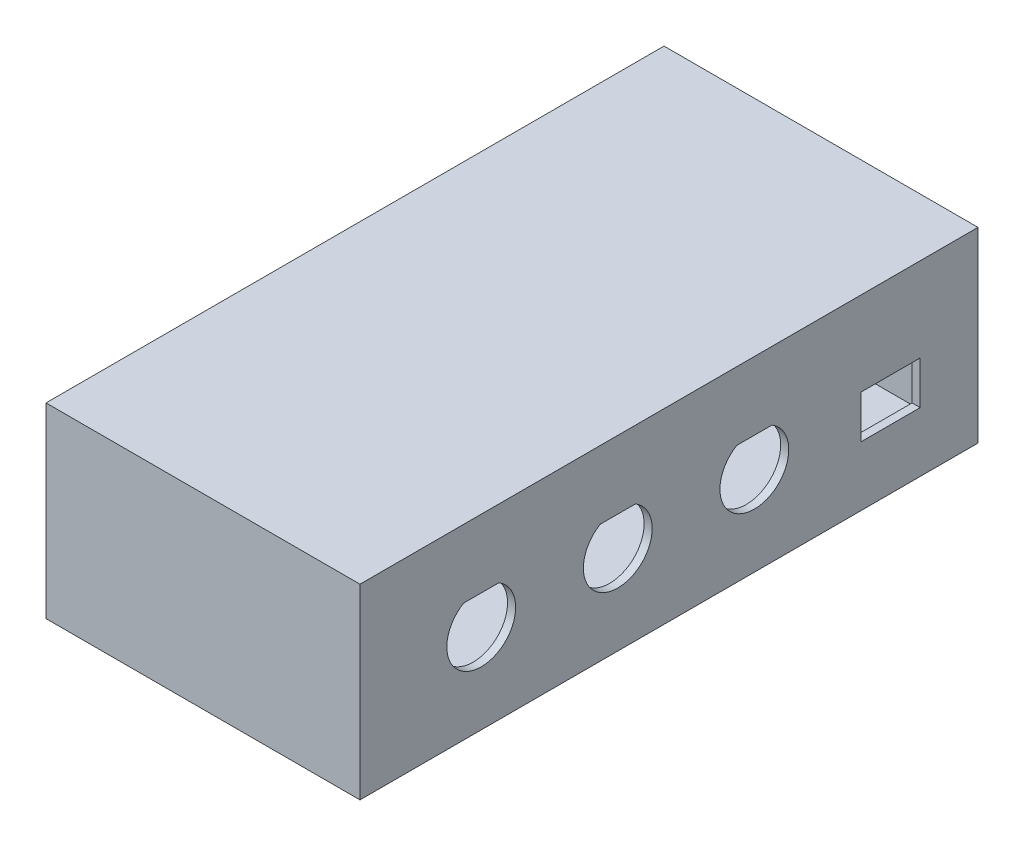
ISO-10303-21;
HEADER;
FILE_DESCRIPTION(('STEP AP214'),'2;1');
FILE_NAME('part.step','',(''),(''),'','','');
FILE_SCHEMA(('AUTOMOTIVE_DESIGN { 1 0 10303 214 1 1 1 1 }'));
ENDSEC;
DATA;
#1=APPLICATION_CONTEXT('core data for automotive mechanical design processes');
#2=APPLICATION_PROTOCOL_DEFINITION('international standard','automotive_design',2000,#1);
#3=PRODUCT_CONTEXT('',#1,'mechanical');
#4=PRODUCT('Part','Part','',(#3));
#5=PRODUCT_RELATED_PRODUCT_CATEGORY('part','',(#4));
#6=PRODUCT_DEFINITION_FORMATION('','',#4);
#7=PRODUCT_DEFINITION_CONTEXT('part definition',#1,'design');
#8=PRODUCT_DEFINITION('design','',#6,#7);
#9=PRODUCT_DEFINITION_SHAPE('','',#8);
#10=(LENGTH_UNIT() NAMED_UNIT(*) SI_UNIT(.MILLI.,.METRE.));
#11=(NAMED_UNIT(*) PLANE_ANGLE_UNIT() SI_UNIT($,.RADIAN.));
#12=(NAMED_UNIT(*) SI_UNIT($,.STERADIAN.) SOLID_ANGLE_UNIT());
#13=UNCERTAINTY_MEASURE_WITH_UNIT(LENGTH_MEASURE(1.E-05),#10,'distance_accuracy_value','');
#14=(GEOMETRIC_REPRESENTATION_CONTEXT(3) GLOBAL_UNCERTAINTY_ASSIGNED_CONTEXT((#13)) GLOBAL_UNIT_ASSIGNED_CONTEXT((#10,
#11,#12)) REPRESENTATION_CONTEXT('',''));
#15=CARTESIAN_POINT('',(0.,0.,0.));
#16=DIRECTION('',(0.,0.,1.));
#17=DIRECTION('',(1.,0.,0.));
#18=AXIS2_PLACEMENT_3D('',#15,#16,#17);
#19=CARTESIAN_POINT('',(-1058.5514361677,31.75,33.6356287123189));
#20=DIRECTION('',(1.,0.,0.));
#21=DIRECTION('',(0.,0.,-1.));
#22=AXIS2_PLACEMENT_3D('',#19,#20,#21);
#23=PLANE('',#22);
#24=DIRECTION('',(0.,0.,1.));
#25=VECTOR('',#24,1.);
#26=CARTESIAN_POINT('',(-1058.5514361677,-1.5,0.));
#27=LINE('',#26,#25);
#28=CARTESIAN_POINT('',(-1058.5514361677,-1.5,-79.8143712876811));
#29=VERTEX_POINT('',#28);
#30=CARTESIAN_POINT('',(-1058.5514361677,-1.5,35.1356287123189));
#31=VERTEX_POINT('',#30);
#32=EDGE_CURVE('E295',#29,#31,#27,.T.);
#33=ORIENTED_EDGE('',*,*,#32,.T.);
#34=DIRECTION('',(0.,-1.,0.));
#35=VECTOR('',#34,1.);
#36=CARTESIAN_POINT('',(-1058.5514361677,31.75,35.1356287123189));
#37=LINE('',#36,#35);
#38=CARTESIAN_POINT('',(-1058.5514361677,33.25,35.1356287123189));
#39=VERTEX_POINT('',#38);
#40=EDGE_CURVE('E292',#39,#31,#37,.T.);
#41=ORIENTED_EDGE('',*,*,#40,.F.);
#42=DIRECTION('',(0.,0.,1.));
#43=VECTOR('',#42,1.);
#44=CARTESIAN_POINT('',(-1058.5514361677,33.25,0.));
#45=LINE('',#44,#43);
#46=CARTESIAN_POINT('',(-1058.5514361677,33.25,-79.8143712876811));
#47=VERTEX_POINT('',#46);
#48=EDGE_CURVE('E41',#47,#39,#45,.T.);
#49=ORIENTED_EDGE('',*,*,#48,.F.);
#50=DIRECTION('',(0.,-1.,0.));
#51=VECTOR('',#50,1.);
#52=CARTESIAN_POINT('',(-1058.5514361677,31.75,-79.8143712876811));
#53=LINE('',#52,#51);
#54=EDGE_CURVE('E46',#47,#29,#53,.T.);
#55=ORIENTED_EDGE('',*,*,#54,.T.);
#56=EDGE_LOOP('',(#33,#41,#49,#55));
#57=FACE_BOUND('',#56,.T.);
#58=DIRECTION('',(0.,0.,1.));
#59=VECTOR('',#58,1.);
#60=CARTESIAN_POINT('',(-1058.5514361677,0.,33.6356287123189));
#61=LINE('',#60,#59);
#62=CARTESIAN_POINT('',(-1058.5514361677,0.,-78.3143712876811));
#63=VERTEX_POINT('',#62);
#64=CARTESIAN_POINT('',(-1058.5514361677,0.,33.6356287123189));
#65=VERTEX_POINT('',#64);
#66=EDGE_CURVE('E266',#63,#65,#61,.T.);
#67=ORIENTED_EDGE('',*,*,#66,.F.);
#68=DIRECTION('',(0.,-1.,0.));
#69=VECTOR('',#68,1.);
#70=CARTESIAN_POINT('',(-1058.5514361677,31.75,-78.3143712876811));
#71=LINE('',#70,#69);
#72=CARTESIAN_POINT('',(-1058.5514361677,31.75,-78.3143712876811));
#73=VERTEX_POINT('',#72);
#74=EDGE_CURVE('E274',#73,#63,#71,.T.);
#75=ORIENTED_EDGE('',*,*,#74,.F.);
#76=DIRECTION('',(0.,0.,1.));
#77=VECTOR('',#76,1.);
#78=CARTESIAN_POINT('',(-1058.5514361677,31.75,33.6356287123189));
#79=LINE('',#78,#77);
#80=CARTESIAN_POINT('',(-1058.5514361677,31.75,33.6356287123189));
#81=VERTEX_POINT('',#80);
#82=EDGE_CURVE('E256',#73,#81,#79,.T.);
#83=ORIENTED_EDGE('',*,*,#82,.T.);
#84=DIRECTION('',(0.,-1.,0.));
#85=VECTOR('',#84,1.);
#86=CARTESIAN_POINT('',(-1058.5514361677,31.75,33.6356287123189));
#87=LINE('',#86,#85);
#88=EDGE_CURVE('E271',#81,#65,#87,.T.);
#89=ORIENTED_EDGE('',*,*,#88,.T.);
#90=EDGE_LOOP('',(#67,#75,#83,#89));
#91=FACE_BOUND('',#90,.T.);
#92=ADVANCED_FACE('F37',(#57,#91),#23,.F.);
#93=CARTESIAN_POINT('',(-1000.1514361677,31.75,33.6356287123189));
#94=DIRECTION('',(-1.,0.,0.));
#95=DIRECTION('',(0.,0.,1.));
#96=AXIS2_PLACEMENT_3D('',#93,#94,#95);
#97=PLANE('',#96);
#98=DIRECTION('',(0.,0.,1.));
#99=VECTOR('',#98,1.);
#100=CARTESIAN_POINT('',(-1000.1514361677,20.5613200000001,15.8582423467096));
#101=LINE('',#100,#99);
#102=CARTESIAN_POINT('',(-1000.1514361677,20.5613200000001,9.31301507792816));
#103=VERTEX_POINT('',#102);
#104=CARTESIAN_POINT('',(-1000.1514361677,20.5613200000001,15.8582423467096));
#105=VERTEX_POINT('',#104);
#106=EDGE_CURVE('E178',#103,#105,#101,.T.);
#107=ORIENTED_EDGE('',*,*,#106,.F.);
#108=CARTESIAN_POINT('',(-1000.1514361677,15.0613200000001,12.5856287123189));
#109=DIRECTION('',(1.,0.,0.));
#110=DIRECTION('',(0.,0.,-1.));
#111=AXIS2_PLACEMENT_3D('',#108,#109,#110);
#112=CIRCLE('',#111,6.4);
#113=EDGE_CURVE('E54',#105,#103,#112,.T.);
#114=ORIENTED_EDGE('',*,*,#113,.F.);
#115=EDGE_LOOP('',(#107,#114));
#116=FACE_BOUND('',#115,.T.);
#117=DIRECTION('',(0.,0.,1.));
#118=VECTOR('',#117,1.);
#119=CARTESIAN_POINT('',(-1000.1514361677,20.5613200000001,-9.54175765329044));
#120=LINE('',#119,#118);
#121=CARTESIAN_POINT('',(-1000.1514361677,20.5613200000001,-16.0869849220719));
#122=VERTEX_POINT('',#121);
#123=CARTESIAN_POINT('',(-1000.1514361677,20.5613200000001,-9.54175765329044));
#124=VERTEX_POINT('',#123);
#125=EDGE_CURVE('E197',#122,#124,#120,.T.);
#126=ORIENTED_EDGE('',*,*,#125,.F.);
#127=CARTESIAN_POINT('',(-1000.1514361677,15.0613200000001,-12.8143712876811));
#128=DIRECTION('',(1.,0.,0.));
#129=DIRECTION('',(0.,0.,-1.));
#130=AXIS2_PLACEMENT_3D('',#127,#128,#129);
#131=CIRCLE('',#130,6.4);
#132=EDGE_CURVE('E62',#124,#122,#131,.T.);
#133=ORIENTED_EDGE('',*,*,#132,.F.);
#134=EDGE_LOOP('',(#126,#133));
#135=FACE_BOUND('',#134,.T.);
#136=DIRECTION('',(0.,0.,1.));
#137=VECTOR('',#136,1.);
#138=CARTESIAN_POINT('',(-1000.1514361677,20.5613200000001,-34.9417576532904));
#139=LINE('',#138,#137);
#140=CARTESIAN_POINT('',(-1000.1514361677,20.5613200000001,-41.4869849220719));
#141=VERTEX_POINT('',#140);
#142=CARTESIAN_POINT('',(-1000.1514361677,20.5613200000001,-34.9417576532904));
#143=VERTEX_POINT('',#142);
#144=EDGE_CURVE('E209',#141,#143,#139,.T.);
#145=ORIENTED_EDGE('',*,*,#144,.F.);
#146=CARTESIAN_POINT('',(-1000.1514361677,15.0613200000001,-38.2143712876811));
#147=DIRECTION('',(1.,0.,0.));
#148=DIRECTION('',(0.,0.,-1.));
#149=AXIS2_PLACEMENT_3D('',#146,#147,#148);
#150=CIRCLE('',#149,6.4);
#151=EDGE_CURVE('E213',#143,#141,#150,.T.);
#152=ORIENTED_EDGE('',*,*,#151,.F.);
#153=EDGE_LOOP('',(#145,#152));
#154=FACE_BOUND('',#153,.T.);
#155=DIRECTION('',(0.,0.,-1.));
#156=VECTOR('',#155,1.);
#157=CARTESIAN_POINT('',(-1000.1514361677,9.59407117880764,-58.0547439493861));
#158=LINE('',#157,#156);
#159=CARTESIAN_POINT('',(-1000.1514361677,9.59407117880764,-58.0547439493861));
#160=VERTEX_POINT('',#159);
#161=CARTESIAN_POINT('',(-1000.1514361677,9.59407117880764,-69.0547439493861));
#162=VERTEX_POINT('',#161);
#163=EDGE_CURVE('E227',#160,#162,#158,.T.);
#164=ORIENTED_EDGE('',*,*,#163,.F.);
#165=DIRECTION('',(0.,-1.,0.));
#166=VECTOR('',#165,1.);
#167=CARTESIAN_POINT('',(-1000.1514361677,17.5940711788076,-58.0547439493861));
#168=LINE('',#167,#166);
#169=CARTESIAN_POINT('',(-1000.1514361677,17.5940711788076,-58.0547439493861));
#170=VERTEX_POINT('',#169);
#171=EDGE_CURVE('E225',#170,#160,#168,.T.);
#172=ORIENTED_EDGE('',*,*,#171,.F.);
#173=DIRECTION('',(0.,0.,1.));
#174=VECTOR('',#173,1.);
#175=CARTESIAN_POINT('',(-1000.1514361677,17.5940711788076,-58.0547439493861));
#176=LINE('',#175,#174);
#177=CARTESIAN_POINT('',(-1000.1514361677,17.5940711788076,-69.0547439493861));
#178=VERTEX_POINT('',#177);
#179=EDGE_CURVE('E233',#178,#170,#176,.T.);
#180=ORIENTED_EDGE('',*,*,#179,.F.);
#181=DIRECTION('',(0.,1.,0.));
#182=VECTOR('',#181,1.);
#183=CARTESIAN_POINT('',(-1000.1514361677,17.5940711788076,-69.0547439493861));
#184=LINE('',#183,#182);
#185=EDGE_CURVE('E230',#162,#178,#184,.T.);
#186=ORIENTED_EDGE('',*,*,#185,.F.);
#187=EDGE_LOOP('',(#164,#172,#180,#186));
#188=FACE_BOUND('',#187,.T.);
#189=DIRECTION('',(0.,0.,-1.));
#190=VECTOR('',#189,1.);
#191=CARTESIAN_POINT('',(-1000.1514361677,-1.5,0.));
#192=LINE('',#191,#190);
#193=CARTESIAN_POINT('',(-1000.1514361677,-1.5,35.1356287123189));
#194=VERTEX_POINT('',#193);
#195=CARTESIAN_POINT('',(-1000.1514361677,-1.5,-79.8143712876811));
#196=VERTEX_POINT('',#195);
#197=EDGE_CURVE('E280',#194,#196,#192,.T.);
#198=ORIENTED_EDGE('',*,*,#197,.T.);
#199=DIRECTION('',(0.,-1.,0.));
#200=VECTOR('',#199,1.);
#201=CARTESIAN_POINT('',(-1000.1514361677,31.75,-79.8143712876811));
#202=LINE('',#201,#200);
#203=CARTESIAN_POINT('',(-1000.1514361677,33.25,-79.8143712876811));
#204=VERTEX_POINT('',#203);
#205=EDGE_CURVE('E11',#204,#196,#202,.T.);
#206=ORIENTED_EDGE('',*,*,#205,.F.);
#207=DIRECTION('',(0.,0.,-1.));
#208=VECTOR('',#207,1.);
#209=CARTESIAN_POINT('',(-1000.1514361677,33.25,0.));
#210=LINE('',#209,#208);
#211=CARTESIAN_POINT('',(-1000.1514361677,33.25,35.1356287123189));
#212=VERTEX_POINT('',#211);
#213=EDGE_CURVE('E284',#212,#204,#210,.T.);
#214=ORIENTED_EDGE('',*,*,#213,.F.);
#215=DIRECTION('',(0.,-1.,0.));
#216=VECTOR('',#215,1.);
#217=CARTESIAN_POINT('',(-1000.1514361677,31.75,35.1356287123189));
#218=LINE('',#217,#216);
#219=EDGE_CURVE('E289',#212,#194,#218,.T.);
#220=ORIENTED_EDGE('',*,*,#219,.T.);
#221=EDGE_LOOP('',(#198,#206,#214,#220));
#222=FACE_BOUND('',#221,.T.);
#223=ADVANCED_FACE('F315',(#116,#135,#154,#188,#222),#97,.F.);
#224=CARTESIAN_POINT('',(-1058.5514361677,31.75,-79.8143712876811));
#225=DIRECTION('',(0.,0.,1.));
#226=DIRECTION('',(1.,0.,0.));
#227=AXIS2_PLACEMENT_3D('',#224,#225,#226);
#228=PLANE('',#227);
#229=DIRECTION('',(-1.,0.,0.));
#230=VECTOR('',#229,1.);
#231=CARTESIAN_POINT('',(0.,-1.5,-79.8143712876811));
#232=LINE('',#231,#230);
#233=EDGE_CURVE('E282',#196,#29,#232,.T.);
#234=ORIENTED_EDGE('',*,*,#233,.T.);
#235=ORIENTED_EDGE('',*,*,#54,.F.);
#236=DIRECTION('',(-1.,0.,0.));
#237=VECTOR('',#236,1.);
#238=CARTESIAN_POINT('',(0.,33.25,-79.8143712876811));
#239=LINE('',#238,#237);
#240=EDGE_CURVE('E287',#204,#47,#239,.T.);
#241=ORIENTED_EDGE('',*,*,#240,.F.);
#242=ORIENTED_EDGE('',*,*,#205,.T.);
#243=EDGE_LOOP('',(#234,#235,#241,#242));
#244=FACE_BOUND('',#243,.T.);
#245=ADVANCED_FACE('F322',(#244),#228,.F.);
#246=CARTESIAN_POINT('',(-1058.5514361677,31.75,35.1356287123189));
#247=DIRECTION('',(0.,0.,-1.));
#248=DIRECTION('',(-1.,0.,0.));
#249=AXIS2_PLACEMENT_3D('',#246,#247,#248);
#250=PLANE('',#249);
#251=DIRECTION('',(1.,0.,0.));
#252=VECTOR('',#251,1.);
#253=CARTESIAN_POINT('',(0.,-1.5,35.1356287123189));
#254=LINE('',#253,#252);
#255=EDGE_CURVE('E288',#31,#194,#254,.T.);
#256=ORIENTED_EDGE('',*,*,#255,.T.);
#257=ORIENTED_EDGE('',*,*,#219,.F.);
#258=DIRECTION('',(1.,0.,0.));
#259=VECTOR('',#258,1.);
#260=CARTESIAN_POINT('',(0.,33.25,35.1356287123189));
#261=LINE('',#260,#259);
#262=EDGE_CURVE('E293',#39,#212,#261,.T.);
#263=ORIENTED_EDGE('',*,*,#262,.F.);
#264=ORIENTED_EDGE('',*,*,#40,.T.);
#265=EDGE_LOOP('',(#256,#257,#263,#264));
#266=FACE_BOUND('',#265,.T.);
#267=ADVANCED_FACE('F306',(#266),#250,.F.);
#268=CARTESIAN_POINT('',(0.,33.25,0.));
#269=DIRECTION('',(0.,-1.,0.));
#270=DIRECTION('',(0.,0.,-1.));
#271=AXIS2_PLACEMENT_3D('',#268,#269,#270);
#272=PLANE('',#271);
#273=ORIENTED_EDGE('',*,*,#213,.T.);
#274=ORIENTED_EDGE('',*,*,#240,.T.);
#275=ORIENTED_EDGE('',*,*,#48,.T.);
#276=ORIENTED_EDGE('',*,*,#262,.T.);
#277=EDGE_LOOP('',(#273,#274,#275,#276));
#278=FACE_BOUND('',#277,.T.);
#279=ADVANCED_FACE('F318',(#278),#272,.F.);
#280=CARTESIAN_POINT('',(0.,-1.5,0.));
#281=DIRECTION('',(0.,-1.,0.));
#282=DIRECTION('',(0.,0.,-1.));
#283=AXIS2_PLACEMENT_3D('',#280,#281,#282);
#284=PLANE('',#283);
#285=ORIENTED_EDGE('',*,*,#197,.F.);
#286=ORIENTED_EDGE('',*,*,#255,.F.);
#287=ORIENTED_EDGE('',*,*,#32,.F.);
#288=ORIENTED_EDGE('',*,*,#233,.F.);
#289=EDGE_LOOP('',(#285,#286,#287,#288));
#290=FACE_BOUND('',#289,.T.);
#291=ADVANCED_FACE('F39',(#290),#284,.T.);
#292=CARTESIAN_POINT('',(-1001.6514361677,31.75,33.6356287123189));
#293=DIRECTION('',(-1.,0.,0.));
#294=DIRECTION('',(0.,0.,1.));
#295=AXIS2_PLACEMENT_3D('',#292,#293,#294);
#296=PLANE('',#295);
#297=CARTESIAN_POINT('',(-1001.6514361677,15.0613200000001,12.5856287123189));
#298=DIRECTION('',(-1.,0.,0.));
#299=DIRECTION('',(0.,0.,1.));
#300=AXIS2_PLACEMENT_3D('',#297,#298,#299);
#301=CIRCLE('',#300,6.4);
#302=CARTESIAN_POINT('',(-1001.6514361677,20.5613200000001,15.8582423467096));
#303=VERTEX_POINT('',#302);
#304=CARTESIAN_POINT('',(-1001.6514361677,20.5613200000001,9.31301507792815));
#305=VERTEX_POINT('',#304);
#306=EDGE_CURVE('E177',#303,#305,#301,.F.);
#307=ORIENTED_EDGE('',*,*,#306,.T.);
#308=DIRECTION('',(0.,0.,1.));
#309=VECTOR('',#308,1.);
#310=CARTESIAN_POINT('',(-1001.6514361677,20.5613200000001,15.8582423467096));
#311=LINE('',#310,#309);
#312=EDGE_CURVE('E165',#305,#303,#311,.T.);
#313=ORIENTED_EDGE('',*,*,#312,.T.);
#314=EDGE_LOOP('',(#307,#313));
#315=FACE_BOUND('',#314,.T.);
#316=CARTESIAN_POINT('',(-1001.6514361677,15.0613200000001,-12.8143712876811));
#317=DIRECTION('',(-1.,0.,0.));
#318=DIRECTION('',(0.,0.,1.));
#319=AXIS2_PLACEMENT_3D('',#316,#317,#318);
#320=CIRCLE('',#319,6.4);
#321=CARTESIAN_POINT('',(-1001.6514361677,20.5613200000001,-9.54175765329044));
#322=VERTEX_POINT('',#321);
#323=CARTESIAN_POINT('',(-1001.6514361677,20.5613200000001,-16.0869849220719));
#324=VERTEX_POINT('',#323);
#325=EDGE_CURVE('E182',#322,#324,#320,.F.);
#326=ORIENTED_EDGE('',*,*,#325,.T.);
#327=DIRECTION('',(0.,0.,1.));
#328=VECTOR('',#327,1.);
#329=CARTESIAN_POINT('',(-1001.6514361677,20.5613200000001,-9.54175765329044));
#330=LINE('',#329,#328);
#331=EDGE_CURVE('E190',#324,#322,#330,.T.);
#332=ORIENTED_EDGE('',*,*,#331,.T.);
#333=EDGE_LOOP('',(#326,#332));
#334=FACE_BOUND('',#333,.T.);
#335=CARTESIAN_POINT('',(-1001.6514361677,15.0613200000001,-38.2143712876811));
#336=DIRECTION('',(-1.,0.,0.));
#337=DIRECTION('',(0.,0.,1.));
#338=AXIS2_PLACEMENT_3D('',#335,#336,#337);
#339=CIRCLE('',#338,6.4);
#340=CARTESIAN_POINT('',(-1001.6514361677,20.5613200000001,-34.9417576532904));
#341=VERTEX_POINT('',#340);
#342=CARTESIAN_POINT('',(-1001.6514361677,20.5613200000001,-41.4869849220719));
#343=VERTEX_POINT('',#342);
#344=EDGE_CURVE('E194',#341,#343,#339,.F.);
#345=ORIENTED_EDGE('',*,*,#344,.T.);
#346=DIRECTION('',(0.,0.,1.));
#347=VECTOR('',#346,1.);
#348=CARTESIAN_POINT('',(-1001.6514361677,20.5613200000001,-34.9417576532904));
#349=LINE('',#348,#347);
#350=EDGE_CURVE('E202',#343,#341,#349,.T.);
#351=ORIENTED_EDGE('',*,*,#350,.T.);
#352=EDGE_LOOP('',(#345,#351));
#353=FACE_BOUND('',#352,.T.);
#354=DIRECTION('',(0.,-1.,0.));
#355=VECTOR('',#354,1.);
#356=CARTESIAN_POINT('',(-1001.6514361677,17.5940711788076,-58.0547439493861));
#357=LINE('',#356,#355);
#358=CARTESIAN_POINT('',(-1001.6514361677,17.5940711788076,-58.0547439493861));
#359=VERTEX_POINT('',#358);
#360=CARTESIAN_POINT('',(-1001.6514361677,9.59407117880764,-58.0547439493861));
#361=VERTEX_POINT('',#360);
#362=EDGE_CURVE('E222',#359,#361,#357,.T.);
#363=ORIENTED_EDGE('',*,*,#362,.T.);
#364=DIRECTION('',(0.,0.,-1.));
#365=VECTOR('',#364,1.);
#366=CARTESIAN_POINT('',(-1001.6514361677,9.59407117880764,-58.0547439493861));
#367=LINE('',#366,#365);
#368=CARTESIAN_POINT('',(-1001.6514361677,9.59407117880764,-69.0547439493861));
#369=VERTEX_POINT('',#368);
#370=EDGE_CURVE('E239',#361,#369,#367,.T.);
#371=ORIENTED_EDGE('',*,*,#370,.T.);
#372=DIRECTION('',(0.,1.,0.));
#373=VECTOR('',#372,1.);
#374=CARTESIAN_POINT('',(-1001.6514361677,17.5940711788076,-69.0547439493861));
#375=LINE('',#374,#373);
#376=CARTESIAN_POINT('',(-1001.6514361677,17.5940711788076,-69.0547439493861));
#377=VERTEX_POINT('',#376);
#378=EDGE_CURVE('E174',#369,#377,#375,.T.);
#379=ORIENTED_EDGE('',*,*,#378,.T.);
#380=DIRECTION('',(0.,0.,1.));
#381=VECTOR('',#380,1.);
#382=CARTESIAN_POINT('',(-1001.6514361677,17.5940711788076,-58.0547439493861));
#383=LINE('',#382,#381);
#384=EDGE_CURVE('E219',#377,#359,#383,.T.);
#385=ORIENTED_EDGE('',*,*,#384,.T.);
#386=EDGE_LOOP('',(#363,#371,#379,#385));
#387=FACE_BOUND('',#386,.T.);
#388=DIRECTION('',(0.,0.,-1.));
#389=VECTOR('',#388,1.);
#390=CARTESIAN_POINT('',(-1001.6514361677,0.,33.6356287123189));
#391=LINE('',#390,#389);
#392=CARTESIAN_POINT('',(-1001.6514361677,0.,33.6356287123189));
#393=VERTEX_POINT('',#392);
#394=CARTESIAN_POINT('',(-1001.6514361677,0.,-78.3143712876811));
#395=VERTEX_POINT('',#394);
#396=EDGE_CURVE('E248',#393,#395,#391,.T.);
#397=ORIENTED_EDGE('',*,*,#396,.F.);
#398=DIRECTION('',(0.,-1.,0.));
#399=VECTOR('',#398,1.);
#400=CARTESIAN_POINT('',(-1001.6514361677,31.75,33.6356287123189));
#401=LINE('',#400,#399);
#402=CARTESIAN_POINT('',(-1001.6514361677,31.75,33.6356287123189));
#403=VERTEX_POINT('',#402);
#404=EDGE_CURVE('E261',#403,#393,#401,.T.);
#405=ORIENTED_EDGE('',*,*,#404,.F.);
#406=DIRECTION('',(0.,0.,-1.));
#407=VECTOR('',#406,1.);
#408=CARTESIAN_POINT('',(-1001.6514361677,31.75,33.6356287123189));
#409=LINE('',#408,#407);
#410=CARTESIAN_POINT('',(-1001.6514361677,31.75,-78.3143712876811));
#411=VERTEX_POINT('',#410);
#412=EDGE_CURVE('E249',#403,#411,#409,.T.);
#413=ORIENTED_EDGE('',*,*,#412,.T.);
#414=DIRECTION('',(0.,-1.,0.));
#415=VECTOR('',#414,1.);
#416=CARTESIAN_POINT('',(-1001.6514361677,31.75,-78.3143712876811));
#417=LINE('',#416,#415);
#418=EDGE_CURVE('E277',#411,#395,#417,.T.);
#419=ORIENTED_EDGE('',*,*,#418,.T.);
#420=EDGE_LOOP('',(#397,#405,#413,#419));
#421=FACE_BOUND('',#420,.T.);
#422=ADVANCED_FACE('F180',(#315,#334,#353,#387,#421),#296,.T.);
#423=CARTESIAN_POINT('',(-1058.5514361677,31.75,-78.3143712876811));
#424=DIRECTION('',(0.,0.,1.));
#425=DIRECTION('',(1.,0.,0.));
#426=AXIS2_PLACEMENT_3D('',#423,#424,#425);
#427=PLANE('',#426);
#428=DIRECTION('',(-1.,0.,0.));
#429=VECTOR('',#428,1.);
#430=CARTESIAN_POINT('',(-1058.5514361677,0.,-78.3143712876811));
#431=LINE('',#430,#429);
#432=EDGE_CURVE('E264',#395,#63,#431,.T.);
#433=ORIENTED_EDGE('',*,*,#432,.F.);
#434=ORIENTED_EDGE('',*,*,#418,.F.);
#435=DIRECTION('',(-1.,0.,0.));
#436=VECTOR('',#435,1.);
#437=CARTESIAN_POINT('',(-1058.5514361677,31.75,-78.3143712876811));
#438=LINE('',#437,#436);
#439=EDGE_CURVE('E252',#411,#73,#438,.T.);
#440=ORIENTED_EDGE('',*,*,#439,.T.);
#441=ORIENTED_EDGE('',*,*,#74,.T.);
#442=EDGE_LOOP('',(#433,#434,#440,#441));
#443=FACE_BOUND('',#442,.T.);
#444=ADVANCED_FACE('F339',(#443),#427,.T.);
#445=CARTESIAN_POINT('',(-1058.5514361677,31.75,33.6356287123189));
#446=DIRECTION('',(0.,0.,-1.));
#447=DIRECTION('',(-1.,0.,0.));
#448=AXIS2_PLACEMENT_3D('',#445,#446,#447);
#449=PLANE('',#448);
#450=DIRECTION('',(1.,0.,0.));
#451=VECTOR('',#450,1.);
#452=CARTESIAN_POINT('',(-1058.5514361677,0.,33.6356287123189));
#453=LINE('',#452,#451);
#454=EDGE_CURVE('E253',#65,#393,#453,.T.);
#455=ORIENTED_EDGE('',*,*,#454,.F.);
#456=ORIENTED_EDGE('',*,*,#88,.F.);
#457=DIRECTION('',(1.,0.,0.));
#458=VECTOR('',#457,1.);
#459=CARTESIAN_POINT('',(-1058.5514361677,31.75,33.6356287123189));
#460=LINE('',#459,#458);
#461=EDGE_CURVE('E259',#81,#403,#460,.T.);
#462=ORIENTED_EDGE('',*,*,#461,.T.);
#463=ORIENTED_EDGE('',*,*,#404,.T.);
#464=EDGE_LOOP('',(#455,#456,#462,#463));
#465=FACE_BOUND('',#464,.T.);
#466=ADVANCED_FACE('F342',(#465),#449,.T.);
#467=CARTESIAN_POINT('',(0.,31.75,0.));
#468=DIRECTION('',(0.,-1.,0.));
#469=DIRECTION('',(0.,0.,-1.));
#470=AXIS2_PLACEMENT_3D('',#467,#468,#469);
#471=PLANE('',#470);
#472=ORIENTED_EDGE('',*,*,#412,.F.);
#473=ORIENTED_EDGE('',*,*,#461,.F.);
#474=ORIENTED_EDGE('',*,*,#82,.F.);
#475=ORIENTED_EDGE('',*,*,#439,.F.);
#476=EDGE_LOOP('',(#472,#473,#474,#475));
#477=FACE_BOUND('',#476,.T.);
#478=ADVANCED_FACE('F346',(#477),#471,.T.);
#479=CARTESIAN_POINT('',(0.,0.,0.));
#480=DIRECTION('',(0.,-1.,0.));
#481=DIRECTION('',(0.,0.,-1.));
#482=AXIS2_PLACEMENT_3D('',#479,#480,#481);
#483=PLANE('',#482);
#484=ORIENTED_EDGE('',*,*,#396,.T.);
#485=ORIENTED_EDGE('',*,*,#432,.T.);
#486=ORIENTED_EDGE('',*,*,#66,.T.);
#487=ORIENTED_EDGE('',*,*,#454,.T.);
#488=EDGE_LOOP('',(#484,#485,#486,#487));
#489=FACE_BOUND('',#488,.T.);
#490=ADVANCED_FACE('F348',(#489),#483,.F.);
#491=CARTESIAN_POINT('',(-1058.5524361677,17.5940711788076,-58.0547439493861));
#492=DIRECTION('',(0.,0.,1.));
#493=DIRECTION('',(1.,0.,0.));
#494=AXIS2_PLACEMENT_3D('',#491,#492,#493);
#495=PLANE('',#494);
#496=DIRECTION('',(1.,0.,0.));
#497=VECTOR('',#496,1.);
#498=CARTESIAN_POINT('',(-1058.5524361677,17.5940711788076,-58.0547439493861));
#499=LINE('',#498,#497);
#500=EDGE_CURVE('E237',#359,#170,#499,.T.);
#501=ORIENTED_EDGE('',*,*,#500,.T.);
#502=ORIENTED_EDGE('',*,*,#171,.T.);
#503=DIRECTION('',(1.,0.,0.));
#504=VECTOR('',#503,1.);
#505=CARTESIAN_POINT('',(-1058.5524361677,9.59407117880764,-58.0547439493861));
#506=LINE('',#505,#504);
#507=EDGE_CURVE('E236',#361,#160,#506,.T.);
#508=ORIENTED_EDGE('',*,*,#507,.F.);
#509=ORIENTED_EDGE('',*,*,#362,.F.);
#510=EDGE_LOOP('',(#501,#502,#508,#509));
#511=FACE_BOUND('',#510,.T.);
#512=ADVANCED_FACE('F351',(#511),#495,.F.);
#513=CARTESIAN_POINT('',(-1058.5524361677,17.5940711788076,-58.0547439493861));
#514=DIRECTION('',(0.,1.,0.));
#515=DIRECTION('',(0.,0.,1.));
#516=AXIS2_PLACEMENT_3D('',#513,#514,#515);
#517=PLANE('',#516);
#518=DIRECTION('',(1.,0.,0.));
#519=VECTOR('',#518,1.);
#520=CARTESIAN_POINT('',(-1058.5524361677,17.5940711788076,-69.0547439493861));
#521=LINE('',#520,#519);
#522=EDGE_CURVE('E240',#377,#178,#521,.T.);
#523=ORIENTED_EDGE('',*,*,#522,.T.);
#524=ORIENTED_EDGE('',*,*,#179,.T.);
#525=ORIENTED_EDGE('',*,*,#500,.F.);
#526=ORIENTED_EDGE('',*,*,#384,.F.);
#527=EDGE_LOOP('',(#523,#524,#525,#526));
#528=FACE_BOUND('',#527,.T.);
#529=ADVANCED_FACE('F358',(#528),#517,.F.);
#530=CARTESIAN_POINT('',(-1058.5524361677,17.5940711788076,-69.0547439493861));
#531=DIRECTION('',(0.,0.,-1.));
#532=DIRECTION('',(-1.,0.,0.));
#533=AXIS2_PLACEMENT_3D('',#530,#531,#532);
#534=PLANE('',#533);
#535=DIRECTION('',(1.,0.,0.));
#536=VECTOR('',#535,1.);
#537=CARTESIAN_POINT('',(-1058.5524361677,9.59407117880764,-69.0547439493861));
#538=LINE('',#537,#536);
#539=EDGE_CURVE('E242',#369,#162,#538,.T.);
#540=ORIENTED_EDGE('',*,*,#539,.T.);
#541=ORIENTED_EDGE('',*,*,#185,.T.);
#542=ORIENTED_EDGE('',*,*,#522,.F.);
#543=ORIENTED_EDGE('',*,*,#378,.F.);
#544=EDGE_LOOP('',(#540,#541,#542,#543));
#545=FACE_BOUND('',#544,.T.);
#546=ADVANCED_FACE('F364',(#545),#534,.F.);
#547=CARTESIAN_POINT('',(-1058.5524361677,9.59407117880764,-58.0547439493861));
#548=DIRECTION('',(0.,-1.,0.));
#549=DIRECTION('',(0.,0.,-1.));
#550=AXIS2_PLACEMENT_3D('',#547,#548,#549);
#551=PLANE('',#550);
#552=ORIENTED_EDGE('',*,*,#507,.T.);
#553=ORIENTED_EDGE('',*,*,#163,.T.);
#554=ORIENTED_EDGE('',*,*,#539,.F.);
#555=ORIENTED_EDGE('',*,*,#370,.F.);
#556=EDGE_LOOP('',(#552,#553,#554,#555));
#557=FACE_BOUND('',#556,.T.);
#558=ADVANCED_FACE('F360',(#557),#551,.F.);
#559=CARTESIAN_POINT('',(-1058.5524361677,15.0613200000001,-38.2143712876811));
#560=DIRECTION('',(1.,0.,0.));
#561=DIRECTION('',(0.,0.,-1.));
#562=AXIS2_PLACEMENT_3D('',#559,#560,#561);
#563=CYLINDRICAL_SURFACE('',#562,6.4);
#564=DIRECTION('',(1.,0.,0.));
#565=VECTOR('',#564,1.);
#566=CARTESIAN_POINT('',(-1058.5524361677,20.5613200000001,-34.9417576532904));
#567=LINE('',#566,#565);
#568=EDGE_CURVE('E205',#341,#143,#567,.T.);
#569=ORIENTED_EDGE('',*,*,#568,.T.);
#570=ORIENTED_EDGE('',*,*,#151,.T.);
#571=DIRECTION('',(1.,0.,0.));
#572=VECTOR('',#571,1.);
#573=CARTESIAN_POINT('',(-1058.5524361677,20.5613200000001,-41.4869849220719));
#574=LINE('',#573,#572);
#575=EDGE_CURVE('E206',#343,#141,#574,.T.);
#576=ORIENTED_EDGE('',*,*,#575,.F.);
#577=ORIENTED_EDGE('',*,*,#344,.F.);
#578=EDGE_LOOP('',(#569,#570,#576,#577));
#579=FACE_BOUND('',#578,.T.);
#580=ADVANCED_FACE('F363',(#579),#563,.F.);
#581=CARTESIAN_POINT('',(-1058.5524361677,20.5613200000001,-34.9417576532904));
#582=DIRECTION('',(0.,1.,0.));
#583=DIRECTION('',(0.,0.,1.));
#584=AXIS2_PLACEMENT_3D('',#581,#582,#583);
#585=PLANE('',#584);
#586=ORIENTED_EDGE('',*,*,#575,.T.);
#587=ORIENTED_EDGE('',*,*,#144,.T.);
#588=ORIENTED_EDGE('',*,*,#568,.F.);
#589=ORIENTED_EDGE('',*,*,#350,.F.);
#590=EDGE_LOOP('',(#586,#587,#588,#589));
#591=FACE_BOUND('',#590,.T.);
#592=ADVANCED_FACE('F372',(#591),#585,.F.);
#593=CARTESIAN_POINT('',(-1058.5524361677,15.0613200000001,-12.8143712876811));
#594=DIRECTION('',(1.,0.,0.));
#595=DIRECTION('',(0.,0.,-1.));
#596=AXIS2_PLACEMENT_3D('',#593,#594,#595);
#597=CYLINDRICAL_SURFACE('',#596,6.4);
#598=DIRECTION('',(1.,0.,0.));
#599=VECTOR('',#598,1.);
#600=CARTESIAN_POINT('',(-1058.5524361677,20.5613200000001,-9.54175765329044));
#601=LINE('',#600,#599);
#602=EDGE_CURVE('E193',#322,#124,#601,.T.);
#603=ORIENTED_EDGE('',*,*,#602,.T.);
#604=ORIENTED_EDGE('',*,*,#132,.T.);
#605=DIRECTION('',(1.,0.,0.));
#606=VECTOR('',#605,1.);
#607=CARTESIAN_POINT('',(-1058.5524361677,20.5613200000001,-16.0869849220719));
#608=LINE('',#607,#606);
#609=EDGE_CURVE('E195',#324,#122,#608,.T.);
#610=ORIENTED_EDGE('',*,*,#609,.F.);
#611=ORIENTED_EDGE('',*,*,#325,.F.);
#612=EDGE_LOOP('',(#603,#604,#610,#611));
#613=FACE_BOUND('',#612,.T.);
#614=ADVANCED_FACE('F375',(#613),#597,.F.);
#615=CARTESIAN_POINT('',(-1058.5524361677,20.5613200000001,-9.54175765329044));
#616=DIRECTION('',(0.,1.,0.));
#617=DIRECTION('',(0.,0.,1.));
#618=AXIS2_PLACEMENT_3D('',#615,#616,#617);
#619=PLANE('',#618);
#620=ORIENTED_EDGE('',*,*,#609,.T.);
#621=ORIENTED_EDGE('',*,*,#125,.T.);
#622=ORIENTED_EDGE('',*,*,#602,.F.);
#623=ORIENTED_EDGE('',*,*,#331,.F.);
#624=EDGE_LOOP('',(#620,#621,#622,#623));
#625=FACE_BOUND('',#624,.T.);
#626=ADVANCED_FACE('F380',(#625),#619,.F.);
#627=CARTESIAN_POINT('',(-1058.5524361677,15.0613200000001,12.5856287123189));
#628=DIRECTION('',(1.,0.,0.));
#629=DIRECTION('',(0.,0.,-1.));
#630=AXIS2_PLACEMENT_3D('',#627,#628,#629);
#631=CYLINDRICAL_SURFACE('',#630,6.4);
#632=DIRECTION('',(1.,0.,0.));
#633=VECTOR('',#632,1.);
#634=CARTESIAN_POINT('',(-1058.5524361677,20.5613200000001,15.8582423467096));
#635=LINE('',#634,#633);
#636=EDGE_CURVE('E170',#303,#105,#635,.T.);
#637=ORIENTED_EDGE('',*,*,#636,.T.);
#638=ORIENTED_EDGE('',*,*,#113,.T.);
#639=DIRECTION('',(1.,0.,0.));
#640=VECTOR('',#639,1.);
#641=CARTESIAN_POINT('',(-1058.5524361677,20.5613200000001,9.31301507792815));
#642=LINE('',#641,#640);
#643=EDGE_CURVE('E168',#305,#103,#642,.T.);
#644=ORIENTED_EDGE('',*,*,#643,.F.);
#645=ORIENTED_EDGE('',*,*,#306,.F.);
#646=EDGE_LOOP('',(#637,#638,#644,#645));
#647=FACE_BOUND('',#646,.T.);
#648=ADVANCED_FACE('F176',(#647),#631,.F.);
#649=CARTESIAN_POINT('',(-1058.5524361677,20.5613200000001,15.8582423467096));
#650=DIRECTION('',(0.,1.,0.));
#651=DIRECTION('',(0.,0.,1.));
#652=AXIS2_PLACEMENT_3D('',#649,#650,#651);
#653=PLANE('',#652);
#654=ORIENTED_EDGE('',*,*,#643,.T.);
#655=ORIENTED_EDGE('',*,*,#106,.T.);
#656=ORIENTED_EDGE('',*,*,#636,.F.);
#657=ORIENTED_EDGE('',*,*,#312,.F.);
#658=EDGE_LOOP('',(#654,#655,#656,#657));
#659=FACE_BOUND('',#658,.T.);
#660=ADVANCED_FACE('F166',(#659),#653,.F.);
#661=CLOSED_SHELL('',(#92,#223,#245,#267,#279,#291,#422,#444,#466,#478,#490,#512,#529,#546,#558,
#580,#592,#614,#626,#648,#660));
#662=MANIFOLD_SOLID_BREP('B2',#661);
#663=ADVANCED_BREP_SHAPE_REPRESENTATION('',(#18,#662),#14);
#664=SHAPE_DEFINITION_REPRESENTATION(#9,#663);
ENDSEC;
END-ISO-10303-21;
